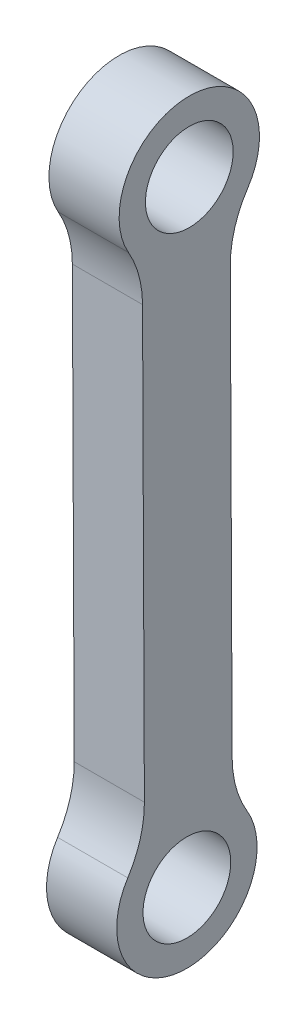
ISO-10303-21;
HEADER;
FILE_DESCRIPTION(('STEP AP214'),'2;1');
FILE_NAME('part.step','',(''),(''),'','','');
FILE_SCHEMA(('AUTOMOTIVE_DESIGN { 1 0 10303 214 1 1 1 1 }'));
ENDSEC;
DATA;
#1=APPLICATION_CONTEXT('core data for automotive mechanical design processes');
#2=APPLICATION_PROTOCOL_DEFINITION('international standard','automotive_design',2000,#1);
#3=PRODUCT_CONTEXT('',#1,'mechanical');
#4=PRODUCT('Part','Part','',(#3));
#5=PRODUCT_RELATED_PRODUCT_CATEGORY('part','',(#4));
#6=PRODUCT_DEFINITION_FORMATION('','',#4);
#7=PRODUCT_DEFINITION_CONTEXT('part definition',#1,'design');
#8=PRODUCT_DEFINITION('design','',#6,#7);
#9=PRODUCT_DEFINITION_SHAPE('','',#8);
#10=(LENGTH_UNIT() NAMED_UNIT(*) SI_UNIT(.MILLI.,.METRE.));
#11=(NAMED_UNIT(*) PLANE_ANGLE_UNIT() SI_UNIT($,.RADIAN.));
#12=(NAMED_UNIT(*) SI_UNIT($,.STERADIAN.) SOLID_ANGLE_UNIT());
#13=UNCERTAINTY_MEASURE_WITH_UNIT(LENGTH_MEASURE(1.E-05),#10,'distance_accuracy_value','');
#14=(GEOMETRIC_REPRESENTATION_CONTEXT(3) GLOBAL_UNCERTAINTY_ASSIGNED_CONTEXT((#13)) GLOBAL_UNIT_ASSIGNED_CONTEXT((#10,
#11,#12)) REPRESENTATION_CONTEXT('',''));
#15=CARTESIAN_POINT('',(0.,0.,0.));
#16=DIRECTION('',(0.,0.,1.));
#17=DIRECTION('',(1.,0.,0.));
#18=AXIS2_PLACEMENT_3D('',#15,#16,#17);
#19=CARTESIAN_POINT('',(4.,124.782968758442,51.8442151718168));
#20=DIRECTION('',(1.,0.,0.));
#21=DIRECTION('',(0.,0.,-1.));
#22=AXIS2_PLACEMENT_3D('',#19,#20,#21);
#23=CYLINDRICAL_SURFACE('',#22,12.0000000000001);
#24=CARTESIAN_POINT('',(12.,124.782968758442,51.8442151718168));
#25=DIRECTION('',(1.,0.,0.));
#26=DIRECTION('',(0.,0.,-1.));
#27=AXIS2_PLACEMENT_3D('',#24,#25,#26);
#28=CIRCLE('',#27,12.0000000000001);
#29=CARTESIAN_POINT('',(12.,124.834383246638,39.8443253160553));
#30=VERTEX_POINT('',#29);
#31=CARTESIAN_POINT('',(12.,118.313187503377,41.7376860687267));
#32=VERTEX_POINT('',#31);
#33=EDGE_CURVE('E20',#30,#32,#28,.F.);
#34=ORIENTED_EDGE('',*,*,#33,.F.);
#35=DIRECTION('',(1.,0.,0.));
#36=VECTOR('',#35,1.);
#37=CARTESIAN_POINT('',(8.,124.834383246638,39.8443253160553));
#38=LINE('',#37,#36);
#39=CARTESIAN_POINT('',(4.,124.834383246638,39.8443253160553));
#40=VERTEX_POINT('',#39);
#41=EDGE_CURVE('E153',#40,#30,#38,.T.);
#42=ORIENTED_EDGE('',*,*,#41,.F.);
#43=CARTESIAN_POINT('',(4.,124.782968758442,51.8442151718168));
#44=DIRECTION('',(1.,0.,0.));
#45=DIRECTION('',(0.,0.,-1.));
#46=AXIS2_PLACEMENT_3D('',#43,#44,#45);
#47=CIRCLE('',#46,12.0000000000001);
#48=CARTESIAN_POINT('',(4.,118.313187503377,41.7376860687267));
#49=VERTEX_POINT('',#48);
#50=EDGE_CURVE('E84',#49,#40,#47,.T.);
#51=ORIENTED_EDGE('',*,*,#50,.F.);
#52=DIRECTION('',(-1.,0.,0.));
#53=VECTOR('',#52,1.);
#54=CARTESIAN_POINT('',(8.,118.313187503377,41.7376860687267));
#55=LINE('',#54,#53);
#56=EDGE_CURVE('E81',#32,#49,#55,.T.);
#57=ORIENTED_EDGE('',*,*,#56,.F.);
#58=EDGE_LOOP('',(#34,#42,#51,#57));
#59=FACE_BOUND('',#58,.T.);
#60=ADVANCED_FACE('F16',(#59),#23,.F.);
#61=CARTESIAN_POINT('',(3.99,174.076388877109,40.0553066290225));
#62=DIRECTION('',(0.,-0.00428454068299149,0.999990821313444));
#63=DIRECTION('',(0.,-0.999990821313444,-0.00428454068299149));
#64=AXIS2_PLACEMENT_3D('',#61,#62,#63);
#65=PLANE('',#64);
#66=DIRECTION('',(0.,-0.999990821313444,-0.00428454068299188));
#67=VECTOR('',#66,1.);
#68=CARTESIAN_POINT('',(12.,174.066388968896,40.0552637836157));
#69=LINE('',#68,#67);
#70=CARTESIAN_POINT('',(12.,174.066388968896,40.0552637836157));
#71=VERTEX_POINT('',#70);
#72=EDGE_CURVE('E98',#71,#30,#69,.T.);
#73=ORIENTED_EDGE('',*,*,#72,.F.);
#74=DIRECTION('',(1.,0.,0.));
#75=VECTOR('',#74,1.);
#76=CARTESIAN_POINT('',(8.,174.066388968896,40.0552637836157));
#77=LINE('',#76,#75);
#78=CARTESIAN_POINT('',(4.,174.066388968896,40.0552637836157));
#79=VERTEX_POINT('',#78);
#80=EDGE_CURVE('E147',#79,#71,#77,.T.);
#81=ORIENTED_EDGE('',*,*,#80,.F.);
#82=DIRECTION('',(0.,0.999990821313444,0.00428454068299175));
#83=VECTOR('',#82,1.);
#84=CARTESIAN_POINT('',(4.,124.834383246638,39.8443253160553));
#85=LINE('',#84,#83);
#86=EDGE_CURVE('E171',#40,#79,#85,.T.);
#87=ORIENTED_EDGE('',*,*,#86,.F.);
#88=ORIENTED_EDGE('',*,*,#41,.T.);
#89=EDGE_LOOP('',(#73,#81,#87,#88));
#90=FACE_BOUND('',#89,.T.);
#91=ADVANCED_FACE('F174',(#90),#65,.T.);
#92=CARTESIAN_POINT('',(4.,174.0149744807,52.0551536393773));
#93=DIRECTION('',(1.,0.,0.));
#94=DIRECTION('',(0.,0.,-1.));
#95=AXIS2_PLACEMENT_3D('',#92,#93,#94);
#96=CYLINDRICAL_SURFACE('',#95,12.0000000000002);
#97=CARTESIAN_POINT('',(12.,174.0149744807,52.0551536393773));
#98=DIRECTION('',(1.,0.,0.));
#99=DIRECTION('',(0.,0.,-1.));
#100=AXIS2_PLACEMENT_3D('',#97,#98,#99);
#101=CIRCLE('',#100,12.0000000000002);
#102=CARTESIAN_POINT('',(12.,180.00566732947,41.6574808616951));
#103=VERTEX_POINT('',#102);
#104=EDGE_CURVE('E101',#103,#71,#101,.F.);
#105=ORIENTED_EDGE('',*,*,#104,.F.);
#106=DIRECTION('',(1.,0.,0.));
#107=VECTOR('',#106,1.);
#108=CARTESIAN_POINT('',(8.,180.005667329471,41.6574808616935));
#109=LINE('',#108,#107);
#110=CARTESIAN_POINT('',(4.,180.005667329471,41.6574808616932));
#111=VERTEX_POINT('',#110);
#112=EDGE_CURVE('E141',#111,#103,#109,.T.);
#113=ORIENTED_EDGE('',*,*,#112,.F.);
#114=CARTESIAN_POINT('',(4.,174.0149744807,52.0551536393773));
#115=DIRECTION('',(1.,0.,0.));
#116=DIRECTION('',(0.,0.,-1.));
#117=AXIS2_PLACEMENT_3D('',#114,#115,#116);
#118=CIRCLE('',#117,12.0000000000002);
#119=EDGE_CURVE('E150',#79,#111,#118,.T.);
#120=ORIENTED_EDGE('',*,*,#119,.F.);
#121=ORIENTED_EDGE('',*,*,#80,.T.);
#122=EDGE_LOOP('',(#105,#113,#120,#121));
#123=FACE_BOUND('',#122,.T.);
#124=ADVANCED_FACE('F149',(#123),#96,.F.);
#125=CARTESIAN_POINT('',(12.,183.999462561985,34.7256990099033));
#126=DIRECTION('',(-1.,0.,0.));
#127=DIRECTION('',(0.,0.,1.));
#128=AXIS2_PLACEMENT_3D('',#125,#126,#127);
#129=CYLINDRICAL_SURFACE('',#128,8.00000000000325);
#130=CARTESIAN_POINT('',(12.,183.999462561985,34.7256990099033));
#131=DIRECTION('',(-1.,0.,0.));
#132=DIRECTION('',(0.,0.,1.));
#133=AXIS2_PLACEMENT_3D('',#130,#131,#132);
#134=CIRCLE('',#133,8.00000000000325);
#135=CARTESIAN_POINT('',(12.,179.58256077169,28.0555431965105));
#136=VERTEX_POINT('',#135);
#137=EDGE_CURVE('E107',#136,#103,#134,.F.);
#138=ORIENTED_EDGE('',*,*,#137,.F.);
#139=DIRECTION('',(1.,0.,0.));
#140=VECTOR('',#139,1.);
#141=CARTESIAN_POINT('',(8.,179.58256077169,28.0555431965106));
#142=LINE('',#141,#140);
#143=CARTESIAN_POINT('',(4.,179.58256077169,28.0555431965106));
#144=VERTEX_POINT('',#143);
#145=EDGE_CURVE('E134',#144,#136,#142,.T.);
#146=ORIENTED_EDGE('',*,*,#145,.F.);
#147=CARTESIAN_POINT('',(4.,183.999462561985,34.7256990099033));
#148=DIRECTION('',(-1.,0.,0.));
#149=DIRECTION('',(0.,0.,1.));
#150=AXIS2_PLACEMENT_3D('',#147,#148,#149);
#151=CIRCLE('',#150,8.00000000000325);
#152=EDGE_CURVE('E143',#111,#144,#151,.T.);
#153=ORIENTED_EDGE('',*,*,#152,.F.);
#154=ORIENTED_EDGE('',*,*,#112,.T.);
#155=EDGE_LOOP('',(#138,#146,#153,#154));
#156=FACE_BOUND('',#155,.T.);
#157=ADVANCED_FACE('F139',(#156),#129,.T.);
#158=CARTESIAN_POINT('',(4.,172.957208086247,18.0503094764214));
#159=DIRECTION('',(1.,0.,0.));
#160=DIRECTION('',(0.,0.,-1.));
#161=AXIS2_PLACEMENT_3D('',#158,#159,#160);
#162=CYLINDRICAL_SURFACE('',#161,12.0000000000049);
#163=CARTESIAN_POINT('',(12.,172.957208086247,18.0503094764214));
#164=DIRECTION('',(1.,0.,0.));
#165=DIRECTION('',(0.,0.,-1.));
#166=AXIS2_PLACEMENT_3D('',#163,#164,#165);
#167=CIRCLE('',#166,12.0000000000049);
#168=CARTESIAN_POINT('',(12.,172.905793598051,30.0501993321822));
#169=VERTEX_POINT('',#168);
#170=EDGE_CURVE('E112',#169,#136,#167,.F.);
#171=ORIENTED_EDGE('',*,*,#170,.F.);
#172=DIRECTION('',(1.,0.,0.));
#173=VECTOR('',#172,1.);
#174=CARTESIAN_POINT('',(8.,172.905793598051,30.0501993321822));
#175=LINE('',#174,#173);
#176=CARTESIAN_POINT('',(4.,172.905793598051,30.0501993321822));
#177=VERTEX_POINT('',#176);
#178=EDGE_CURVE('E126',#177,#169,#175,.T.);
#179=ORIENTED_EDGE('',*,*,#178,.F.);
#180=CARTESIAN_POINT('',(4.,172.957208086247,18.0503094764214));
#181=DIRECTION('',(1.,0.,0.));
#182=DIRECTION('',(0.,0.,-1.));
#183=AXIS2_PLACEMENT_3D('',#180,#181,#182);
#184=CIRCLE('',#183,12.0000000000049);
#185=EDGE_CURVE('E167',#144,#177,#184,.T.);
#186=ORIENTED_EDGE('',*,*,#185,.F.);
#187=ORIENTED_EDGE('',*,*,#145,.T.);
#188=EDGE_LOOP('',(#171,#179,#186,#187));
#189=FACE_BOUND('',#188,.T.);
#190=ADVANCED_FACE('F136',(#189),#162,.F.);
#191=CARTESIAN_POINT('',(3.99,124.214469310171,29.8415774574873));
#192=DIRECTION('',(0.,0.00428454068298974,-0.999990821313444));
#193=DIRECTION('',(0.,0.999990821313444,0.00428454068298974));
#194=AXIS2_PLACEMENT_3D('',#191,#192,#193);
#195=PLANE('',#194);
#196=DIRECTION('',(0.,0.999990821313444,0.00428454068299092));
#197=VECTOR('',#196,1.);
#198=CARTESIAN_POINT('',(12.,124.224469218384,29.8416203028941));
#199=LINE('',#198,#197);
#200=CARTESIAN_POINT('',(12.,124.224469218384,29.8416203028941));
#201=VERTEX_POINT('',#200);
#202=EDGE_CURVE('E115',#201,#169,#199,.T.);
#203=ORIENTED_EDGE('',*,*,#202,.F.);
#204=DIRECTION('',(1.,0.,0.));
#205=VECTOR('',#204,1.);
#206=CARTESIAN_POINT('',(8.,124.224469218384,29.8416203028941));
#207=LINE('',#206,#205);
#208=CARTESIAN_POINT('',(4.,124.224469218384,29.8416203028941));
#209=VERTEX_POINT('',#208);
#210=EDGE_CURVE('E120',#209,#201,#207,.T.);
#211=ORIENTED_EDGE('',*,*,#210,.F.);
#212=DIRECTION('',(0.,-0.999990821313444,-0.00428454068299093));
#213=VECTOR('',#212,1.);
#214=CARTESIAN_POINT('',(4.,172.905793598051,30.0501993321822));
#215=LINE('',#214,#213);
#216=EDGE_CURVE('E130',#177,#209,#215,.T.);
#217=ORIENTED_EDGE('',*,*,#216,.F.);
#218=ORIENTED_EDGE('',*,*,#178,.T.);
#219=EDGE_LOOP('',(#203,#211,#217,#218));
#220=FACE_BOUND('',#219,.T.);
#221=ADVANCED_FACE('F128',(#220),#195,.T.);
#222=CARTESIAN_POINT('',(4.,124.27588370658,17.8417304471324));
#223=DIRECTION('',(1.,0.,0.));
#224=DIRECTION('',(0.,0.,-1.));
#225=AXIS2_PLACEMENT_3D('',#222,#223,#224);
#226=CYLINDRICAL_SURFACE('',#225,12.0000000000004);
#227=CARTESIAN_POINT('',(12.,124.27588370658,17.8417304471324));
#228=DIRECTION('',(1.,0.,0.));
#229=DIRECTION('',(0.,0.,-1.));
#230=AXIS2_PLACEMENT_3D('',#227,#228,#229);
#231=CIRCLE('',#230,12.0000000000004);
#232=CARTESIAN_POINT('',(12.,118.110353482632,28.1366921788531));
#233=VERTEX_POINT('',#232);
#234=EDGE_CURVE('E93',#233,#201,#231,.F.);
#235=ORIENTED_EDGE('',*,*,#234,.F.);
#236=DIRECTION('',(1.,0.,0.));
#237=VECTOR('',#236,1.);
#238=CARTESIAN_POINT('',(8.,118.110353482632,28.1366921788531));
#239=LINE('',#238,#237);
#240=CARTESIAN_POINT('',(4.,118.110353482632,28.1366921788531));
#241=VERTEX_POINT('',#240);
#242=EDGE_CURVE('E35',#241,#233,#239,.T.);
#243=ORIENTED_EDGE('',*,*,#242,.F.);
#244=CARTESIAN_POINT('',(4.,124.27588370658,17.8417304471324));
#245=DIRECTION('',(1.,0.,0.));
#246=DIRECTION('',(0.,0.,-1.));
#247=AXIS2_PLACEMENT_3D('',#244,#245,#246);
#248=CIRCLE('',#247,12.0000000000004);
#249=EDGE_CURVE('E122',#209,#241,#248,.T.);
#250=ORIENTED_EDGE('',*,*,#249,.F.);
#251=ORIENTED_EDGE('',*,*,#210,.T.);
#252=EDGE_LOOP('',(#235,#243,#250,#251));
#253=FACE_BOUND('',#252,.T.);
#254=ADVANCED_FACE('F119',(#253),#226,.F.);
#255=CARTESIAN_POINT('',(12.,114.,35.));
#256=DIRECTION('',(-1.,0.,0.));
#257=DIRECTION('',(0.,0.,1.));
#258=AXIS2_PLACEMENT_3D('',#255,#256,#257);
#259=CYLINDRICAL_SURFACE('',#258,8.00000000000004);
#260=CARTESIAN_POINT('',(12.,114.,35.));
#261=DIRECTION('',(-1.,0.,0.));
#262=DIRECTION('',(0.,0.,1.));
#263=AXIS2_PLACEMENT_3D('',#260,#261,#262);
#264=CIRCLE('',#263,8.00000000000004);
#265=EDGE_CURVE('E89',#32,#233,#264,.F.);
#266=ORIENTED_EDGE('',*,*,#265,.F.);
#267=ORIENTED_EDGE('',*,*,#56,.T.);
#268=CARTESIAN_POINT('',(4.,114.,35.));
#269=DIRECTION('',(-1.,0.,0.));
#270=DIRECTION('',(0.,0.,1.));
#271=AXIS2_PLACEMENT_3D('',#268,#269,#270);
#272=CIRCLE('',#271,8.00000000000004);
#273=EDGE_CURVE('E163',#241,#49,#272,.T.);
#274=ORIENTED_EDGE('',*,*,#273,.F.);
#275=ORIENTED_EDGE('',*,*,#242,.T.);
#276=EDGE_LOOP('',(#266,#267,#274,#275));
#277=FACE_BOUND('',#276,.T.);
#278=ADVANCED_FACE('F90',(#277),#259,.T.);
#279=CARTESIAN_POINT('',(4.,183.999462561986,34.7256990099037));
#280=DIRECTION('',(1.,0.,0.));
#281=DIRECTION('',(0.,0.,-1.));
#282=AXIS2_PLACEMENT_3D('',#279,#280,#281);
#283=CYLINDRICAL_SURFACE('',#282,4.99999999999999);
#284=CARTESIAN_POINT('',(4.,183.999462561986,34.7256990099037));
#285=DIRECTION('',(1.,0.,0.));
#286=DIRECTION('',(0.,0.,-1.));
#287=AXIS2_PLACEMENT_3D('',#284,#285,#286);
#288=CIRCLE('',#287,4.99999999999999);
#289=CARTESIAN_POINT('',(4.,183.999462561986,29.7256990099037));
#290=VERTEX_POINT('',#289);
#291=EDGE_CURVE('E160',#290,#290,#288,.T.);
#292=ORIENTED_EDGE('',*,*,#291,.F.);
#293=EDGE_LOOP('',(#292));
#294=FACE_BOUND('',#293,.T.);
#295=CARTESIAN_POINT('',(12.,183.999462561986,34.7256990099037));
#296=DIRECTION('',(1.,0.,0.));
#297=DIRECTION('',(0.,0.,-1.));
#298=AXIS2_PLACEMENT_3D('',#295,#296,#297);
#299=CIRCLE('',#298,4.99999999999999);
#300=CARTESIAN_POINT('',(12.,183.999462561986,29.7256990099037));
#301=VERTEX_POINT('',#300);
#302=EDGE_CURVE('E103',#301,#301,#299,.F.);
#303=ORIENTED_EDGE('',*,*,#302,.F.);
#304=EDGE_LOOP('',(#303));
#305=FACE_BOUND('',#304,.T.);
#306=ADVANCED_FACE('F196',(#294,#305),#283,.F.);
#307=CARTESIAN_POINT('',(12.,103.456261195552,24.2629022986916));
#308=DIRECTION('',(1.,0.,0.));
#309=DIRECTION('',(0.,1.,0.));
#310=AXIS2_PLACEMENT_3D('',#307,#308,#309);
#311=PLANE('',#310);
#312=CARTESIAN_POINT('',(12.,114.,35.));
#313=DIRECTION('',(1.,0.,0.));
#314=DIRECTION('',(0.,0.,-1.));
#315=AXIS2_PLACEMENT_3D('',#312,#313,#314);
#316=CIRCLE('',#315,5.);
#317=CARTESIAN_POINT('',(12.,114.,30.));
#318=VERTEX_POINT('',#317);
#319=EDGE_CURVE('E26',#318,#318,#316,.T.);
#320=ORIENTED_EDGE('',*,*,#319,.F.);
#321=EDGE_LOOP('',(#320));
#322=FACE_BOUND('',#321,.T.);
#323=ORIENTED_EDGE('',*,*,#302,.T.);
#324=EDGE_LOOP('',(#323));
#325=FACE_BOUND('',#324,.T.);
#326=ORIENTED_EDGE('',*,*,#104,.T.);
#327=ORIENTED_EDGE('',*,*,#72,.T.);
#328=ORIENTED_EDGE('',*,*,#33,.T.);
#329=ORIENTED_EDGE('',*,*,#265,.T.);
#330=ORIENTED_EDGE('',*,*,#234,.T.);
#331=ORIENTED_EDGE('',*,*,#202,.T.);
#332=ORIENTED_EDGE('',*,*,#170,.T.);
#333=ORIENTED_EDGE('',*,*,#137,.T.);
#334=EDGE_LOOP('',(#326,#327,#328,#329,#330,#331,#332,#333));
#335=FACE_BOUND('',#334,.T.);
#336=ADVANCED_FACE('F96',(#322,#325,#335),#311,.T.);
#337=CARTESIAN_POINT('',(4.,194.537133434891,24.2629022986916));
#338=DIRECTION('',(-1.,0.,0.));
#339=DIRECTION('',(0.,-1.,0.));
#340=AXIS2_PLACEMENT_3D('',#337,#338,#339);
#341=PLANE('',#340);
#342=CARTESIAN_POINT('',(4.,114.,35.));
#343=DIRECTION('',(1.,0.,0.));
#344=DIRECTION('',(0.,0.,-1.));
#345=AXIS2_PLACEMENT_3D('',#342,#343,#344);
#346=CIRCLE('',#345,5.);
#347=CARTESIAN_POINT('',(4.,114.,30.));
#348=VERTEX_POINT('',#347);
#349=EDGE_CURVE('E11',#348,#348,#346,.F.);
#350=ORIENTED_EDGE('',*,*,#349,.F.);
#351=EDGE_LOOP('',(#350));
#352=FACE_BOUND('',#351,.T.);
#353=ORIENTED_EDGE('',*,*,#291,.T.);
#354=EDGE_LOOP('',(#353));
#355=FACE_BOUND('',#354,.T.);
#356=ORIENTED_EDGE('',*,*,#249,.T.);
#357=ORIENTED_EDGE('',*,*,#273,.T.);
#358=ORIENTED_EDGE('',*,*,#50,.T.);
#359=ORIENTED_EDGE('',*,*,#86,.T.);
#360=ORIENTED_EDGE('',*,*,#119,.T.);
#361=ORIENTED_EDGE('',*,*,#152,.T.);
#362=ORIENTED_EDGE('',*,*,#185,.T.);
#363=ORIENTED_EDGE('',*,*,#216,.T.);
#364=EDGE_LOOP('',(#356,#357,#358,#359,#360,#361,#362,#363));
#365=FACE_BOUND('',#364,.T.);
#366=ADVANCED_FACE('F173',(#352,#355,#365),#341,.T.);
#367=CARTESIAN_POINT('',(4.,114.,35.));
#368=DIRECTION('',(1.,0.,0.));
#369=DIRECTION('',(0.,0.,-1.));
#370=AXIS2_PLACEMENT_3D('',#367,#368,#369);
#371=CYLINDRICAL_SURFACE('',#370,5.);
#372=ORIENTED_EDGE('',*,*,#349,.T.);
#373=EDGE_LOOP('',(#372));
#374=FACE_BOUND('',#373,.T.);
#375=ORIENTED_EDGE('',*,*,#319,.T.);
#376=EDGE_LOOP('',(#375));
#377=FACE_BOUND('',#376,.T.);
#378=ADVANCED_FACE('F18',(#374,#377),#371,.F.);
#379=CLOSED_SHELL('',(#60,#91,#124,#157,#190,#221,#254,#278,#306,#336,#366,#378));
#380=MANIFOLD_SOLID_BREP('B1',#379);
#381=ADVANCED_BREP_SHAPE_REPRESENTATION('',(#18,#380),#14);
#382=SHAPE_DEFINITION_REPRESENTATION(#9,#381);
ENDSEC;
END-ISO-10303-21;
